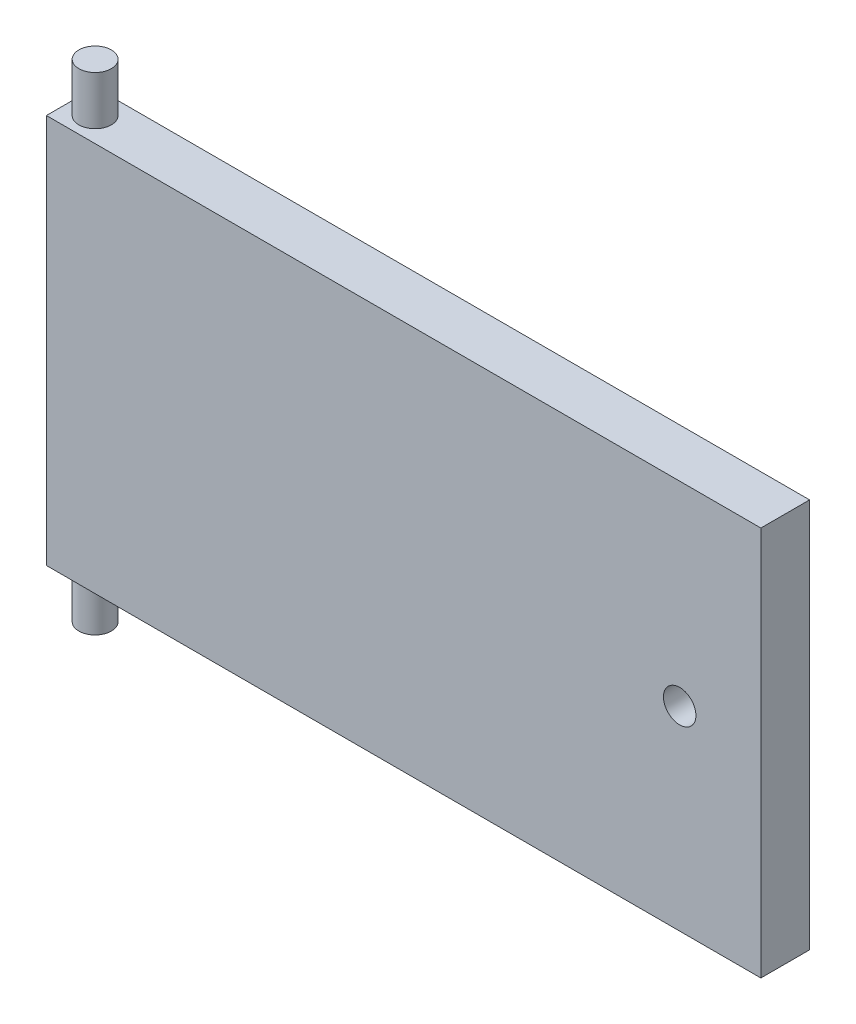
ISO-10303-21;
HEADER;
FILE_DESCRIPTION(('STEP AP214'),'2;1');
FILE_NAME('part.step','',(''),(''),'','','');
FILE_SCHEMA(('AUTOMOTIVE_DESIGN { 1 0 10303 214 1 1 1 1 }'));
ENDSEC;
DATA;
#1=APPLICATION_CONTEXT('core data for automotive mechanical design processes');
#2=APPLICATION_PROTOCOL_DEFINITION('international standard','automotive_design',2000,#1);
#3=PRODUCT_CONTEXT('',#1,'mechanical');
#4=PRODUCT('Part','Part','',(#3));
#5=PRODUCT_RELATED_PRODUCT_CATEGORY('part','',(#4));
#6=PRODUCT_DEFINITION_FORMATION('','',#4);
#7=PRODUCT_DEFINITION_CONTEXT('part definition',#1,'design');
#8=PRODUCT_DEFINITION('design','',#6,#7);
#9=PRODUCT_DEFINITION_SHAPE('','',#8);
#10=(LENGTH_UNIT() NAMED_UNIT(*) SI_UNIT(.MILLI.,.METRE.));
#11=(NAMED_UNIT(*) PLANE_ANGLE_UNIT() SI_UNIT($,.RADIAN.));
#12=(NAMED_UNIT(*) SI_UNIT($,.STERADIAN.) SOLID_ANGLE_UNIT());
#13=UNCERTAINTY_MEASURE_WITH_UNIT(LENGTH_MEASURE(1.E-05),#10,'distance_accuracy_value','');
#14=(GEOMETRIC_REPRESENTATION_CONTEXT(3) GLOBAL_UNCERTAINTY_ASSIGNED_CONTEXT((#13)) GLOBAL_UNIT_ASSIGNED_CONTEXT((#10,
#11,#12)) REPRESENTATION_CONTEXT('',''));
#15=CARTESIAN_POINT('',(0.,0.,0.));
#16=DIRECTION('',(0.,0.,1.));
#17=DIRECTION('',(1.,0.,0.));
#18=AXIS2_PLACEMENT_3D('',#15,#16,#17);
#19=CARTESIAN_POINT('',(0.,0.,15.));
#20=DIRECTION('',(1.,0.,0.));
#21=DIRECTION('',(0.,1.,0.));
#22=AXIS2_PLACEMENT_3D('',#19,#20,#21);
#23=PLANE('',#22);
#24=DIRECTION('',(0.,-1.,0.));
#25=VECTOR('',#24,1.);
#26=CARTESIAN_POINT('',(0.,0.,0.));
#27=LINE('',#26,#25);
#28=CARTESIAN_POINT('',(0.,0.,0.));
#29=VERTEX_POINT('',#28);
#30=CARTESIAN_POINT('',(0.,-120.,0.));
#31=VERTEX_POINT('',#30);
#32=EDGE_CURVE('E103',#29,#31,#27,.T.);
#33=ORIENTED_EDGE('',*,*,#32,.T.);
#34=DIRECTION('',(0.,0.,-1.));
#35=VECTOR('',#34,1.);
#36=CARTESIAN_POINT('',(0.,-120.,15.));
#37=LINE('',#36,#35);
#38=CARTESIAN_POINT('',(0.,-120.,15.));
#39=VERTEX_POINT('',#38);
#40=EDGE_CURVE('E11',#39,#31,#37,.T.);
#41=ORIENTED_EDGE('',*,*,#40,.F.);
#42=DIRECTION('',(0.,-1.,0.));
#43=VECTOR('',#42,1.);
#44=CARTESIAN_POINT('',(0.,0.,15.));
#45=LINE('',#44,#43);
#46=CARTESIAN_POINT('',(0.,0.,15.));
#47=VERTEX_POINT('',#46);
#48=EDGE_CURVE('E90',#47,#39,#45,.T.);
#49=ORIENTED_EDGE('',*,*,#48,.F.);
#50=DIRECTION('',(0.,0.,-1.));
#51=VECTOR('',#50,1.);
#52=CARTESIAN_POINT('',(0.,0.,15.));
#53=LINE('',#52,#51);
#54=EDGE_CURVE('E99',#47,#29,#53,.T.);
#55=ORIENTED_EDGE('',*,*,#54,.T.);
#56=EDGE_LOOP('',(#33,#41,#49,#55));
#57=FACE_BOUND('',#56,.T.);
#58=ADVANCED_FACE('F37',(#57),#23,.F.);
#59=CARTESIAN_POINT('',(0.,-120.,15.));
#60=DIRECTION('',(0.,1.,0.));
#61=DIRECTION('',(0.,0.,1.));
#62=AXIS2_PLACEMENT_3D('',#59,#60,#61);
#63=PLANE('',#62);
#64=CARTESIAN_POINT('',(7.5,-120.,7.5));
#65=DIRECTION('',(0.,1.,0.));
#66=DIRECTION('',(0.,0.,1.));
#67=AXIS2_PLACEMENT_3D('',#64,#65,#66);
#68=CIRCLE('',#67,5.);
#69=CARTESIAN_POINT('',(7.5,-120.,12.5));
#70=VERTEX_POINT('',#69);
#71=EDGE_CURVE('E106',#70,#70,#68,.T.);
#72=ORIENTED_EDGE('',*,*,#71,.T.);
#73=EDGE_LOOP('',(#72));
#74=FACE_BOUND('',#73,.T.);
#75=DIRECTION('',(1.,0.,0.));
#76=VECTOR('',#75,1.);
#77=CARTESIAN_POINT('',(0.,-120.,0.));
#78=LINE('',#77,#76);
#79=CARTESIAN_POINT('',(220.,-120.,0.));
#80=VERTEX_POINT('',#79);
#81=EDGE_CURVE('E94',#31,#80,#78,.T.);
#82=ORIENTED_EDGE('',*,*,#81,.T.);
#83=DIRECTION('',(0.,0.,-1.));
#84=VECTOR('',#83,1.);
#85=CARTESIAN_POINT('',(220.,-120.,15.));
#86=LINE('',#85,#84);
#87=CARTESIAN_POINT('',(220.,-120.,15.));
#88=VERTEX_POINT('',#87);
#89=EDGE_CURVE('E46',#88,#80,#86,.T.);
#90=ORIENTED_EDGE('',*,*,#89,.F.);
#91=DIRECTION('',(1.,0.,0.));
#92=VECTOR('',#91,1.);
#93=CARTESIAN_POINT('',(0.,-120.,15.));
#94=LINE('',#93,#92);
#95=EDGE_CURVE('E85',#39,#88,#94,.T.);
#96=ORIENTED_EDGE('',*,*,#95,.F.);
#97=ORIENTED_EDGE('',*,*,#40,.T.);
#98=EDGE_LOOP('',(#82,#90,#96,#97));
#99=FACE_BOUND('',#98,.T.);
#100=ADVANCED_FACE('F93',(#74,#99),#63,.F.);
#101=CARTESIAN_POINT('',(220.,0.,15.));
#102=DIRECTION('',(-1.,0.,0.));
#103=DIRECTION('',(0.,0.,1.));
#104=AXIS2_PLACEMENT_3D('',#101,#102,#103);
#105=PLANE('',#104);
#106=DIRECTION('',(0.,1.,0.));
#107=VECTOR('',#106,1.);
#108=CARTESIAN_POINT('',(220.,0.,0.));
#109=LINE('',#108,#107);
#110=CARTESIAN_POINT('',(220.,0.,0.));
#111=VERTEX_POINT('',#110);
#112=EDGE_CURVE('E72',#80,#111,#109,.T.);
#113=ORIENTED_EDGE('',*,*,#112,.T.);
#114=DIRECTION('',(0.,0.,-1.));
#115=VECTOR('',#114,1.);
#116=CARTESIAN_POINT('',(220.,0.,15.));
#117=LINE('',#116,#115);
#118=CARTESIAN_POINT('',(220.,0.,15.));
#119=VERTEX_POINT('',#118);
#120=EDGE_CURVE('E95',#119,#111,#117,.T.);
#121=ORIENTED_EDGE('',*,*,#120,.F.);
#122=DIRECTION('',(0.,1.,0.));
#123=VECTOR('',#122,1.);
#124=CARTESIAN_POINT('',(220.,0.,15.));
#125=LINE('',#124,#123);
#126=EDGE_CURVE('E88',#88,#119,#125,.T.);
#127=ORIENTED_EDGE('',*,*,#126,.F.);
#128=ORIENTED_EDGE('',*,*,#89,.T.);
#129=EDGE_LOOP('',(#113,#121,#127,#128));
#130=FACE_BOUND('',#129,.T.);
#131=ADVANCED_FACE('F97',(#130),#105,.F.);
#132=CARTESIAN_POINT('',(0.,0.,15.));
#133=DIRECTION('',(0.,-1.,0.));
#134=DIRECTION('',(0.,0.,-1.));
#135=AXIS2_PLACEMENT_3D('',#132,#133,#134);
#136=PLANE('',#135);
#137=CARTESIAN_POINT('',(7.5,0.,7.5));
#138=DIRECTION('',(0.,-1.,0.));
#139=DIRECTION('',(0.,0.,-1.));
#140=AXIS2_PLACEMENT_3D('',#137,#138,#139);
#141=CIRCLE('',#140,5.);
#142=CARTESIAN_POINT('',(7.5,0.,2.5));
#143=VERTEX_POINT('',#142);
#144=EDGE_CURVE('E111',#143,#143,#141,.T.);
#145=ORIENTED_EDGE('',*,*,#144,.T.);
#146=EDGE_LOOP('',(#145));
#147=FACE_BOUND('',#146,.T.);
#148=DIRECTION('',(-1.,0.,0.));
#149=VECTOR('',#148,1.);
#150=CARTESIAN_POINT('',(0.,0.,0.));
#151=LINE('',#150,#149);
#152=EDGE_CURVE('E78',#111,#29,#151,.T.);
#153=ORIENTED_EDGE('',*,*,#152,.T.);
#154=ORIENTED_EDGE('',*,*,#54,.F.);
#155=DIRECTION('',(-1.,0.,0.));
#156=VECTOR('',#155,1.);
#157=CARTESIAN_POINT('',(0.,0.,15.));
#158=LINE('',#157,#156);
#159=EDGE_CURVE('E55',#119,#47,#158,.T.);
#160=ORIENTED_EDGE('',*,*,#159,.F.);
#161=ORIENTED_EDGE('',*,*,#120,.T.);
#162=EDGE_LOOP('',(#153,#154,#160,#161));
#163=FACE_BOUND('',#162,.T.);
#164=ADVANCED_FACE('F163',(#147,#163),#136,.F.);
#165=CARTESIAN_POINT('',(0.,0.,15.));
#166=DIRECTION('',(0.,0.,1.));
#167=DIRECTION('',(1.,0.,0.));
#168=AXIS2_PLACEMENT_3D('',#165,#166,#167);
#169=PLANE('',#168);
#170=CARTESIAN_POINT('',(195.,-60.,15.));
#171=DIRECTION('',(0.,0.,1.));
#172=DIRECTION('',(1.,0.,0.));
#173=AXIS2_PLACEMENT_3D('',#170,#171,#172);
#174=CIRCLE('',#173,4.99999999999999);
#175=CARTESIAN_POINT('',(200.,-60.,15.));
#176=VERTEX_POINT('',#175);
#177=EDGE_CURVE('E126',#176,#176,#174,.T.);
#178=ORIENTED_EDGE('',*,*,#177,.F.);
#179=EDGE_LOOP('',(#178));
#180=FACE_BOUND('',#179,.T.);
#181=ORIENTED_EDGE('',*,*,#48,.T.);
#182=ORIENTED_EDGE('',*,*,#95,.T.);
#183=ORIENTED_EDGE('',*,*,#126,.T.);
#184=ORIENTED_EDGE('',*,*,#159,.T.);
#185=EDGE_LOOP('',(#181,#182,#183,#184));
#186=FACE_BOUND('',#185,.T.);
#187=ADVANCED_FACE('F86',(#180,#186),#169,.T.);
#188=CARTESIAN_POINT('',(0.,0.,0.));
#189=DIRECTION('',(0.,0.,1.));
#190=DIRECTION('',(1.,0.,0.));
#191=AXIS2_PLACEMENT_3D('',#188,#189,#190);
#192=PLANE('',#191);
#193=CARTESIAN_POINT('',(195.,-60.,0.));
#194=DIRECTION('',(0.,0.,1.));
#195=DIRECTION('',(1.,0.,0.));
#196=AXIS2_PLACEMENT_3D('',#193,#194,#195);
#197=CIRCLE('',#196,4.99999999999999);
#198=CARTESIAN_POINT('',(200.,-60.,0.));
#199=VERTEX_POINT('',#198);
#200=EDGE_CURVE('E40',#199,#199,#197,.T.);
#201=ORIENTED_EDGE('',*,*,#200,.T.);
#202=EDGE_LOOP('',(#201));
#203=FACE_BOUND('',#202,.T.);
#204=ORIENTED_EDGE('',*,*,#32,.F.);
#205=ORIENTED_EDGE('',*,*,#152,.F.);
#206=ORIENTED_EDGE('',*,*,#112,.F.);
#207=ORIENTED_EDGE('',*,*,#81,.F.);
#208=EDGE_LOOP('',(#204,#205,#206,#207));
#209=FACE_BOUND('',#208,.T.);
#210=ADVANCED_FACE('F133',(#203,#209),#192,.F.);
#211=CARTESIAN_POINT('',(7.5,15.,7.5));
#212=DIRECTION('',(0.,1.,0.));
#213=DIRECTION('',(0.,0.,1.));
#214=AXIS2_PLACEMENT_3D('',#211,#212,#213);
#215=PLANE('',#214);
#216=CARTESIAN_POINT('',(7.5,15.,7.5));
#217=DIRECTION('',(0.,1.,0.));
#218=DIRECTION('',(0.,0.,1.));
#219=AXIS2_PLACEMENT_3D('',#216,#217,#218);
#220=CIRCLE('',#219,5.);
#221=CARTESIAN_POINT('',(7.5,15.,12.5));
#222=VERTEX_POINT('',#221);
#223=EDGE_CURVE('E119',#222,#222,#220,.T.);
#224=ORIENTED_EDGE('',*,*,#223,.T.);
#225=EDGE_LOOP('',(#224));
#226=FACE_BOUND('',#225,.T.);
#227=ADVANCED_FACE('F155',(#226),#215,.T.);
#228=CARTESIAN_POINT('',(7.5,-135.,7.5));
#229=DIRECTION('',(0.,1.,0.));
#230=DIRECTION('',(0.,0.,1.));
#231=AXIS2_PLACEMENT_3D('',#228,#229,#230);
#232=CYLINDRICAL_SURFACE('',#231,5.);
#233=ORIENTED_EDGE('',*,*,#223,.F.);
#234=EDGE_LOOP('',(#233));
#235=FACE_BOUND('',#234,.T.);
#236=ORIENTED_EDGE('',*,*,#144,.F.);
#237=EDGE_LOOP('',(#236));
#238=FACE_BOUND('',#237,.T.);
#239=ADVANCED_FACE('F161',(#235,#238),#232,.T.);
#240=CARTESIAN_POINT('',(7.5,-135.,7.5));
#241=DIRECTION('',(0.,1.,0.));
#242=DIRECTION('',(0.,0.,1.));
#243=AXIS2_PLACEMENT_3D('',#240,#241,#242);
#244=CIRCLE('',#243,5.);
#245=CARTESIAN_POINT('',(7.5,-135.,12.5));
#246=VERTEX_POINT('',#245);
#247=EDGE_CURVE('E113',#246,#246,#244,.T.);
#248=ORIENTED_EDGE('',*,*,#247,.T.);
#249=EDGE_LOOP('',(#248));
#250=FACE_BOUND('',#249,.T.);
#251=ORIENTED_EDGE('',*,*,#71,.F.);
#252=EDGE_LOOP('',(#251));
#253=FACE_BOUND('',#252,.T.);
#254=ADVANCED_FACE('F143',(#250,#253),#232,.T.);
#255=CARTESIAN_POINT('',(7.5,-135.,7.5));
#256=DIRECTION('',(0.,1.,0.));
#257=DIRECTION('',(0.,0.,1.));
#258=AXIS2_PLACEMENT_3D('',#255,#256,#257);
#259=PLANE('',#258);
#260=ORIENTED_EDGE('',*,*,#247,.F.);
#261=EDGE_LOOP('',(#260));
#262=FACE_BOUND('',#261,.T.);
#263=ADVANCED_FACE('F138',(#262),#259,.F.);
#264=CARTESIAN_POINT('',(195.,-60.,-10.));
#265=DIRECTION('',(0.,0.,1.));
#266=DIRECTION('',(1.,0.,0.));
#267=AXIS2_PLACEMENT_3D('',#264,#265,#266);
#268=CYLINDRICAL_SURFACE('',#267,4.99999999999999);
#269=ORIENTED_EDGE('',*,*,#177,.T.);
#270=EDGE_LOOP('',(#269));
#271=FACE_BOUND('',#270,.T.);
#272=ORIENTED_EDGE('',*,*,#200,.F.);
#273=EDGE_LOOP('',(#272));
#274=FACE_BOUND('',#273,.T.);
#275=ADVANCED_FACE('F136',(#271,#274),#268,.F.);
#276=CLOSED_SHELL('',(#58,#100,#131,#164,#187,#210,#227,#239,#254,#263,#275));
#277=MANIFOLD_SOLID_BREP('B2',#276);
#278=ADVANCED_BREP_SHAPE_REPRESENTATION('',(#18,#277),#14);
#279=SHAPE_DEFINITION_REPRESENTATION(#9,#278);
ENDSEC;
END-ISO-10303-21;
